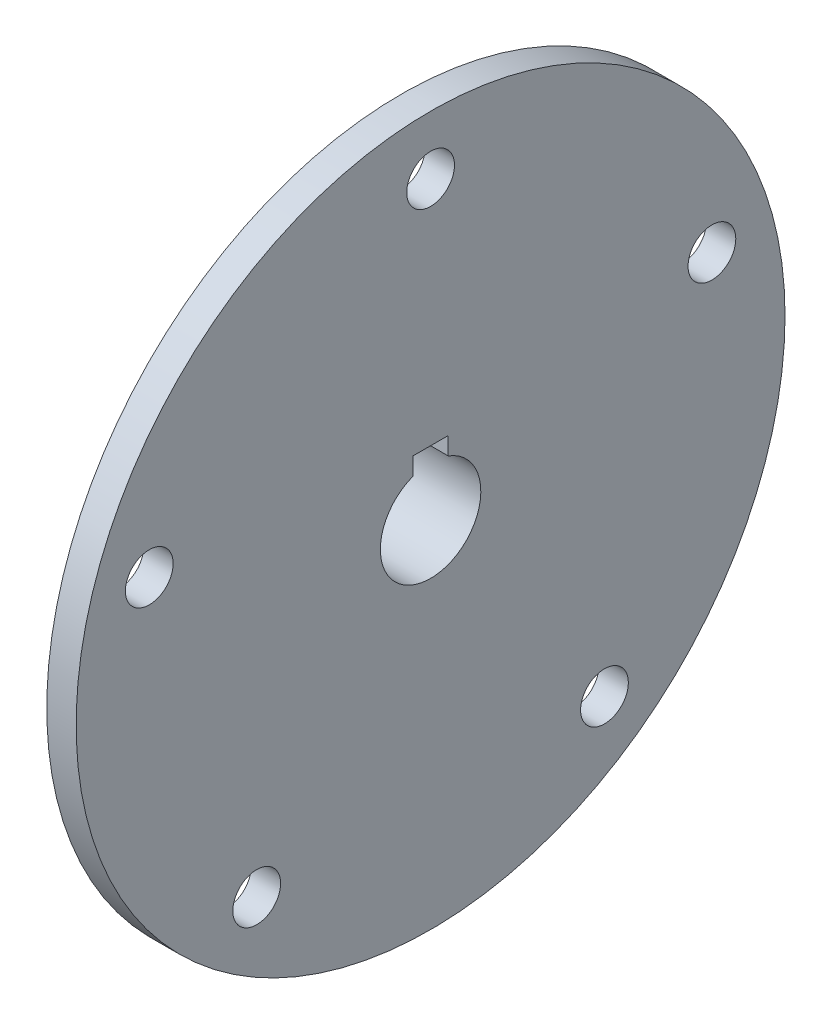
ISO-10303-21;
HEADER;
FILE_DESCRIPTION(('STEP AP214'),'2;1');
FILE_NAME('part.step','',(''),(''),'','','');
FILE_SCHEMA(('AUTOMOTIVE_DESIGN { 1 0 10303 214 1 1 1 1 }'));
ENDSEC;
DATA;
#1=APPLICATION_CONTEXT('core data for automotive mechanical design processes');
#2=APPLICATION_PROTOCOL_DEFINITION('international standard','automotive_design',2000,#1);
#3=PRODUCT_CONTEXT('',#1,'mechanical');
#4=PRODUCT('Part','Part','',(#3));
#5=PRODUCT_RELATED_PRODUCT_CATEGORY('part','',(#4));
#6=PRODUCT_DEFINITION_FORMATION('','',#4);
#7=PRODUCT_DEFINITION_CONTEXT('part definition',#1,'design');
#8=PRODUCT_DEFINITION('design','',#6,#7);
#9=PRODUCT_DEFINITION_SHAPE('','',#8);
#10=(LENGTH_UNIT() NAMED_UNIT(*) SI_UNIT(.MILLI.,.METRE.));
#11=(NAMED_UNIT(*) PLANE_ANGLE_UNIT() SI_UNIT($,.RADIAN.));
#12=(NAMED_UNIT(*) SI_UNIT($,.STERADIAN.) SOLID_ANGLE_UNIT());
#13=UNCERTAINTY_MEASURE_WITH_UNIT(LENGTH_MEASURE(1.E-05),#10,'distance_accuracy_value','');
#14=(GEOMETRIC_REPRESENTATION_CONTEXT(3) GLOBAL_UNCERTAINTY_ASSIGNED_CONTEXT((#13)) GLOBAL_UNIT_ASSIGNED_CONTEXT((#10,
#11,#12)) REPRESENTATION_CONTEXT('',''));
#15=CARTESIAN_POINT('',(0.,0.,0.));
#16=DIRECTION('',(0.,0.,1.));
#17=DIRECTION('',(1.,0.,0.));
#18=AXIS2_PLACEMENT_3D('',#15,#16,#17);
#19=CARTESIAN_POINT('',(-5.,0.,0.));
#20=DIRECTION('',(1.,0.,0.));
#21=DIRECTION('',(0.,0.,-1.));
#22=AXIS2_PLACEMENT_3D('',#19,#20,#21);
#23=CYLINDRICAL_SURFACE('',#22,60.325);
#24=CARTESIAN_POINT('',(-5.,0.,0.));
#25=DIRECTION('',(1.,0.,0.));
#26=DIRECTION('',(0.,0.,-1.));
#27=AXIS2_PLACEMENT_3D('',#24,#25,#26);
#28=CIRCLE('',#27,60.325);
#29=CARTESIAN_POINT('',(-5.,0.,-60.325));
#30=VERTEX_POINT('',#29);
#31=EDGE_CURVE('E48',#30,#30,#28,.T.);
#32=ORIENTED_EDGE('',*,*,#31,.T.);
#33=EDGE_LOOP('',(#32));
#34=FACE_BOUND('',#33,.T.);
#35=CARTESIAN_POINT('',(0.,0.,0.));
#36=DIRECTION('',(1.,0.,0.));
#37=DIRECTION('',(0.,0.,-1.));
#38=AXIS2_PLACEMENT_3D('',#35,#36,#37);
#39=CIRCLE('',#38,60.325);
#40=CARTESIAN_POINT('',(0.,0.,-60.325));
#41=VERTEX_POINT('',#40);
#42=EDGE_CURVE('E125',#41,#41,#39,.T.);
#43=ORIENTED_EDGE('',*,*,#42,.F.);
#44=EDGE_LOOP('',(#43));
#45=FACE_BOUND('',#44,.T.);
#46=ADVANCED_FACE('F41',(#34,#45),#23,.T.);
#47=CARTESIAN_POINT('',(-5.,0.,0.));
#48=DIRECTION('',(1.,0.,0.));
#49=DIRECTION('',(0.,0.,-1.));
#50=AXIS2_PLACEMENT_3D('',#47,#48,#49);
#51=PLANE('',#50);
#52=CARTESIAN_POINT('',(-5.,0.,0.));
#53=DIRECTION('',(1.,0.,0.));
#54=DIRECTION('',(0.,0.,-1.));
#55=AXIS2_PLACEMENT_3D('',#52,#53,#54);
#56=CIRCLE('',#55,17.5);
#57=CARTESIAN_POINT('',(-5.,0.,-17.5));
#58=VERTEX_POINT('',#57);
#59=EDGE_CURVE('E11',#58,#58,#56,.F.);
#60=ORIENTED_EDGE('',*,*,#59,.F.);
#61=EDGE_LOOP('',(#60));
#62=FACE_BOUND('',#61,.T.);
#63=CARTESIAN_POINT('',(-5.,50.342959834304,0.));
#64=DIRECTION('',(1.,0.,0.));
#65=DIRECTION('',(0.,0.,-1.));
#66=AXIS2_PLACEMENT_3D('',#63,#64,#65);
#67=CIRCLE('',#66,4.064);
#68=CARTESIAN_POINT('',(-5.,50.342959834304,-4.064));
#69=VERTEX_POINT('',#68);
#70=EDGE_CURVE('E122',#69,#69,#67,.T.);
#71=ORIENTED_EDGE('',*,*,#70,.T.);
#72=EDGE_LOOP('',(#71));
#73=FACE_BOUND('',#72,.T.);
#74=CARTESIAN_POINT('',(-5.,15.5568301359353,-47.879));
#75=DIRECTION('',(1.,0.,0.));
#76=DIRECTION('',(0.,0.,-1.));
#77=AXIS2_PLACEMENT_3D('',#74,#75,#76);
#78=CIRCLE('',#77,4.06400000000012);
#79=CARTESIAN_POINT('',(-5.,15.5568301359353,-51.9430000000001));
#80=VERTEX_POINT('',#79);
#81=EDGE_CURVE('E132',#80,#80,#78,.T.);
#82=ORIENTED_EDGE('',*,*,#81,.T.);
#83=EDGE_LOOP('',(#82));
#84=FACE_BOUND('',#83,.T.);
#85=CARTESIAN_POINT('',(-5.,-40.7283100530873,-29.5908493473562));
#86=DIRECTION('',(1.,0.,0.));
#87=DIRECTION('',(0.,0.,-1.));
#88=AXIS2_PLACEMENT_3D('',#85,#86,#87);
#89=CIRCLE('',#88,4.064);
#90=CARTESIAN_POINT('',(-5.,-40.7283100530873,-33.6548493473562));
#91=VERTEX_POINT('',#90);
#92=EDGE_CURVE('E138',#91,#91,#89,.T.);
#93=ORIENTED_EDGE('',*,*,#92,.T.);
#94=EDGE_LOOP('',(#93));
#95=FACE_BOUND('',#94,.T.);
#96=CARTESIAN_POINT('',(-5.,-40.7283100530873,29.5908493473563));
#97=DIRECTION('',(1.,0.,0.));
#98=DIRECTION('',(0.,0.,-1.));
#99=AXIS2_PLACEMENT_3D('',#96,#97,#98);
#100=CIRCLE('',#99,4.06400000000001);
#101=CARTESIAN_POINT('',(-5.,-40.7283100530873,25.5268493473562));
#102=VERTEX_POINT('',#101);
#103=EDGE_CURVE('E144',#102,#102,#100,.T.);
#104=ORIENTED_EDGE('',*,*,#103,.T.);
#105=EDGE_LOOP('',(#104));
#106=FACE_BOUND('',#105,.T.);
#107=CARTESIAN_POINT('',(-5.,15.5568301359353,47.879));
#108=DIRECTION('',(1.,0.,0.));
#109=DIRECTION('',(0.,0.,-1.));
#110=AXIS2_PLACEMENT_3D('',#107,#108,#109);
#111=CIRCLE('',#110,4.06400000000002);
#112=CARTESIAN_POINT('',(-5.,15.5568301359353,43.815));
#113=VERTEX_POINT('',#112);
#114=EDGE_CURVE('E121',#113,#113,#111,.T.);
#115=ORIENTED_EDGE('',*,*,#114,.T.);
#116=EDGE_LOOP('',(#115));
#117=FACE_BOUND('',#116,.T.);
#118=ORIENTED_EDGE('',*,*,#31,.F.);
#119=EDGE_LOOP('',(#118));
#120=FACE_BOUND('',#119,.T.);
#121=ADVANCED_FACE('F158',(#62,#73,#84,#95,#106,#117,#120),#51,.F.);
#122=CARTESIAN_POINT('',(0.,0.,0.));
#123=DIRECTION('',(1.,0.,0.));
#124=DIRECTION('',(0.,0.,-1.));
#125=AXIS2_PLACEMENT_3D('',#122,#123,#124);
#126=PLANE('',#125);
#127=DIRECTION('',(0.,1.,0.));
#128=VECTOR('',#127,1.);
#129=CARTESIAN_POINT('',(0.,11.0064036870495,3.));
#130=LINE('',#129,#128);
#131=CARTESIAN_POINT('',(0.,8.00640368704951,3.));
#132=VERTEX_POINT('',#131);
#133=CARTESIAN_POINT('',(0.,11.0064036870495,3.));
#134=VERTEX_POINT('',#133);
#135=EDGE_CURVE('E96',#132,#134,#130,.T.);
#136=ORIENTED_EDGE('',*,*,#135,.T.);
#137=DIRECTION('',(0.,0.,-1.));
#138=VECTOR('',#137,1.);
#139=CARTESIAN_POINT('',(0.,11.0064036870495,0.));
#140=LINE('',#139,#138);
#141=CARTESIAN_POINT('',(0.,11.0064036870495,-3.));
#142=VERTEX_POINT('',#141);
#143=EDGE_CURVE('E102',#134,#142,#140,.T.);
#144=ORIENTED_EDGE('',*,*,#143,.T.);
#145=DIRECTION('',(0.,-1.,0.));
#146=VECTOR('',#145,1.);
#147=CARTESIAN_POINT('',(0.,11.0064036870495,-3.));
#148=LINE('',#147,#146);
#149=CARTESIAN_POINT('',(0.,8.00640368704951,-3.));
#150=VERTEX_POINT('',#149);
#151=EDGE_CURVE('E55',#142,#150,#148,.T.);
#152=ORIENTED_EDGE('',*,*,#151,.T.);
#153=CARTESIAN_POINT('',(0.,0.,0.));
#154=DIRECTION('',(-1.,0.,0.));
#155=DIRECTION('',(0.,0.,1.));
#156=AXIS2_PLACEMENT_3D('',#153,#154,#155);
#157=CIRCLE('',#156,8.55);
#158=EDGE_CURVE('E91',#150,#132,#157,.T.);
#159=ORIENTED_EDGE('',*,*,#158,.T.);
#160=EDGE_LOOP('',(#136,#144,#152,#159));
#161=FACE_BOUND('',#160,.T.);
#162=CARTESIAN_POINT('',(0.,50.342959834304,0.));
#163=DIRECTION('',(1.,0.,0.));
#164=DIRECTION('',(0.,0.,-1.));
#165=AXIS2_PLACEMENT_3D('',#162,#163,#164);
#166=CIRCLE('',#165,4.064);
#167=CARTESIAN_POINT('',(0.,50.342959834304,-4.064));
#168=VERTEX_POINT('',#167);
#169=EDGE_CURVE('E126',#168,#168,#166,.T.);
#170=ORIENTED_EDGE('',*,*,#169,.F.);
#171=EDGE_LOOP('',(#170));
#172=FACE_BOUND('',#171,.T.);
#173=CARTESIAN_POINT('',(0.,15.5568301359353,-47.879));
#174=DIRECTION('',(1.,0.,0.));
#175=DIRECTION('',(0.,0.,-1.));
#176=AXIS2_PLACEMENT_3D('',#173,#174,#175);
#177=CIRCLE('',#176,4.06400000000012);
#178=CARTESIAN_POINT('',(0.,15.5568301359353,-51.9430000000001));
#179=VERTEX_POINT('',#178);
#180=EDGE_CURVE('E129',#179,#179,#177,.T.);
#181=ORIENTED_EDGE('',*,*,#180,.F.);
#182=EDGE_LOOP('',(#181));
#183=FACE_BOUND('',#182,.T.);
#184=CARTESIAN_POINT('',(0.,-40.7283100530873,-29.5908493473562));
#185=DIRECTION('',(1.,0.,0.));
#186=DIRECTION('',(0.,0.,-1.));
#187=AXIS2_PLACEMENT_3D('',#184,#185,#186);
#188=CIRCLE('',#187,4.064);
#189=CARTESIAN_POINT('',(0.,-40.7283100530873,-33.6548493473562));
#190=VERTEX_POINT('',#189);
#191=EDGE_CURVE('E135',#190,#190,#188,.T.);
#192=ORIENTED_EDGE('',*,*,#191,.F.);
#193=EDGE_LOOP('',(#192));
#194=FACE_BOUND('',#193,.T.);
#195=CARTESIAN_POINT('',(0.,-40.7283100530873,29.5908493473563));
#196=DIRECTION('',(1.,0.,0.));
#197=DIRECTION('',(0.,0.,-1.));
#198=AXIS2_PLACEMENT_3D('',#195,#196,#197);
#199=CIRCLE('',#198,4.06400000000001);
#200=CARTESIAN_POINT('',(0.,-40.7283100530873,25.5268493473562));
#201=VERTEX_POINT('',#200);
#202=EDGE_CURVE('E141',#201,#201,#199,.T.);
#203=ORIENTED_EDGE('',*,*,#202,.F.);
#204=EDGE_LOOP('',(#203));
#205=FACE_BOUND('',#204,.T.);
#206=CARTESIAN_POINT('',(0.,15.5568301359353,47.879));
#207=DIRECTION('',(1.,0.,0.));
#208=DIRECTION('',(0.,0.,-1.));
#209=AXIS2_PLACEMENT_3D('',#206,#207,#208);
#210=CIRCLE('',#209,4.06400000000002);
#211=CARTESIAN_POINT('',(0.,15.5568301359353,43.815));
#212=VERTEX_POINT('',#211);
#213=EDGE_CURVE('E147',#212,#212,#210,.T.);
#214=ORIENTED_EDGE('',*,*,#213,.F.);
#215=EDGE_LOOP('',(#214));
#216=FACE_BOUND('',#215,.T.);
#217=ORIENTED_EDGE('',*,*,#42,.T.);
#218=EDGE_LOOP('',(#217));
#219=FACE_BOUND('',#218,.T.);
#220=ADVANCED_FACE('F99',(#161,#172,#183,#194,#205,#216,#219),#126,.T.);
#221=CARTESIAN_POINT('',(-5.,15.5568301359353,47.879));
#222=DIRECTION('',(1.,0.,0.));
#223=DIRECTION('',(0.,0.,-1.));
#224=AXIS2_PLACEMENT_3D('',#221,#222,#223);
#225=CYLINDRICAL_SURFACE('',#224,4.06400000000002);
#226=ORIENTED_EDGE('',*,*,#114,.F.);
#227=EDGE_LOOP('',(#226));
#228=FACE_BOUND('',#227,.T.);
#229=ORIENTED_EDGE('',*,*,#213,.T.);
#230=EDGE_LOOP('',(#229));
#231=FACE_BOUND('',#230,.T.);
#232=ADVANCED_FACE('F170',(#228,#231),#225,.F.);
#233=CARTESIAN_POINT('',(-5.,-40.7283100530873,29.5908493473563));
#234=DIRECTION('',(1.,0.,0.));
#235=DIRECTION('',(0.,0.,-1.));
#236=AXIS2_PLACEMENT_3D('',#233,#234,#235);
#237=CYLINDRICAL_SURFACE('',#236,4.06400000000001);
#238=ORIENTED_EDGE('',*,*,#103,.F.);
#239=EDGE_LOOP('',(#238));
#240=FACE_BOUND('',#239,.T.);
#241=ORIENTED_EDGE('',*,*,#202,.T.);
#242=EDGE_LOOP('',(#241));
#243=FACE_BOUND('',#242,.T.);
#244=ADVANCED_FACE('F176',(#240,#243),#237,.F.);
#245=CARTESIAN_POINT('',(-5.,-40.7283100530873,-29.5908493473562));
#246=DIRECTION('',(1.,0.,0.));
#247=DIRECTION('',(0.,0.,-1.));
#248=AXIS2_PLACEMENT_3D('',#245,#246,#247);
#249=CYLINDRICAL_SURFACE('',#248,4.064);
#250=ORIENTED_EDGE('',*,*,#92,.F.);
#251=EDGE_LOOP('',(#250));
#252=FACE_BOUND('',#251,.T.);
#253=ORIENTED_EDGE('',*,*,#191,.T.);
#254=EDGE_LOOP('',(#253));
#255=FACE_BOUND('',#254,.T.);
#256=ADVANCED_FACE('F180',(#252,#255),#249,.F.);
#257=CARTESIAN_POINT('',(-5.,15.5568301359353,-47.879));
#258=DIRECTION('',(1.,0.,0.));
#259=DIRECTION('',(0.,0.,-1.));
#260=AXIS2_PLACEMENT_3D('',#257,#258,#259);
#261=CYLINDRICAL_SURFACE('',#260,4.06400000000012);
#262=ORIENTED_EDGE('',*,*,#81,.F.);
#263=EDGE_LOOP('',(#262));
#264=FACE_BOUND('',#263,.T.);
#265=ORIENTED_EDGE('',*,*,#180,.T.);
#266=EDGE_LOOP('',(#265));
#267=FACE_BOUND('',#266,.T.);
#268=ADVANCED_FACE('F184',(#264,#267),#261,.F.);
#269=CARTESIAN_POINT('',(-5.,50.342959834304,0.));
#270=DIRECTION('',(1.,0.,0.));
#271=DIRECTION('',(0.,0.,-1.));
#272=AXIS2_PLACEMENT_3D('',#269,#270,#271);
#273=CYLINDRICAL_SURFACE('',#272,4.064);
#274=ORIENTED_EDGE('',*,*,#70,.F.);
#275=EDGE_LOOP('',(#274));
#276=FACE_BOUND('',#275,.T.);
#277=ORIENTED_EDGE('',*,*,#169,.T.);
#278=EDGE_LOOP('',(#277));
#279=FACE_BOUND('',#278,.T.);
#280=ADVANCED_FACE('F188',(#276,#279),#273,.F.);
#281=CARTESIAN_POINT('',(-35.,0.,0.));
#282=DIRECTION('',(1.,0.,0.));
#283=DIRECTION('',(0.,0.,-1.));
#284=AXIS2_PLACEMENT_3D('',#281,#282,#283);
#285=CYLINDRICAL_SURFACE('',#284,17.5);
#286=CARTESIAN_POINT('',(-35.,0.,0.));
#287=DIRECTION('',(-1.,0.,0.));
#288=DIRECTION('',(0.,0.,1.));
#289=AXIS2_PLACEMENT_3D('',#286,#287,#288);
#290=CIRCLE('',#289,17.5);
#291=CARTESIAN_POINT('',(-35.,0.,17.5));
#292=VERTEX_POINT('',#291);
#293=EDGE_CURVE('E116',#292,#292,#290,.T.);
#294=ORIENTED_EDGE('',*,*,#293,.F.);
#295=EDGE_LOOP('',(#294));
#296=FACE_BOUND('',#295,.T.);
#297=ORIENTED_EDGE('',*,*,#59,.T.);
#298=EDGE_LOOP('',(#297));
#299=FACE_BOUND('',#298,.T.);
#300=ADVANCED_FACE('F192',(#296,#299),#285,.T.);
#301=CARTESIAN_POINT('',(-35.,0.,0.));
#302=DIRECTION('',(-1.,0.,0.));
#303=DIRECTION('',(0.,0.,1.));
#304=AXIS2_PLACEMENT_3D('',#301,#302,#303);
#305=PLANE('',#304);
#306=DIRECTION('',(0.,1.,0.));
#307=VECTOR('',#306,1.);
#308=CARTESIAN_POINT('',(-35.,11.0064036870495,3.));
#309=LINE('',#308,#307);
#310=CARTESIAN_POINT('',(-35.,8.00640368704951,3.));
#311=VERTEX_POINT('',#310);
#312=CARTESIAN_POINT('',(-35.,11.0064036870495,3.));
#313=VERTEX_POINT('',#312);
#314=EDGE_CURVE('E63',#311,#313,#309,.T.);
#315=ORIENTED_EDGE('',*,*,#314,.F.);
#316=CARTESIAN_POINT('',(-35.,0.,0.));
#317=DIRECTION('',(-1.,0.,0.));
#318=DIRECTION('',(0.,0.,1.));
#319=AXIS2_PLACEMENT_3D('',#316,#317,#318);
#320=CIRCLE('',#319,8.55);
#321=CARTESIAN_POINT('',(-35.,8.00640368704951,-3.));
#322=VERTEX_POINT('',#321);
#323=EDGE_CURVE('E111',#322,#311,#320,.T.);
#324=ORIENTED_EDGE('',*,*,#323,.F.);
#325=DIRECTION('',(0.,-1.,0.));
#326=VECTOR('',#325,1.);
#327=CARTESIAN_POINT('',(-35.,11.0064036870495,-3.));
#328=LINE('',#327,#326);
#329=CARTESIAN_POINT('',(-35.,11.0064036870495,-3.));
#330=VERTEX_POINT('',#329);
#331=EDGE_CURVE('E83',#330,#322,#328,.T.);
#332=ORIENTED_EDGE('',*,*,#331,.F.);
#333=DIRECTION('',(0.,0.,-1.));
#334=VECTOR('',#333,1.);
#335=CARTESIAN_POINT('',(-35.,11.0064036870495,0.));
#336=LINE('',#335,#334);
#337=EDGE_CURVE('E107',#313,#330,#336,.T.);
#338=ORIENTED_EDGE('',*,*,#337,.F.);
#339=EDGE_LOOP('',(#315,#324,#332,#338));
#340=FACE_BOUND('',#339,.T.);
#341=ORIENTED_EDGE('',*,*,#293,.T.);
#342=EDGE_LOOP('',(#341));
#343=FACE_BOUND('',#342,.T.);
#344=ADVANCED_FACE('F196',(#340,#343),#305,.T.);
#345=CARTESIAN_POINT('',(0.,11.0064036870495,3.));
#346=DIRECTION('',(0.,0.,1.));
#347=DIRECTION('',(0.,-1.,0.));
#348=AXIS2_PLACEMENT_3D('',#345,#346,#347);
#349=PLANE('',#348);
#350=ORIENTED_EDGE('',*,*,#314,.T.);
#351=DIRECTION('',(-1.,0.,0.));
#352=VECTOR('',#351,1.);
#353=CARTESIAN_POINT('',(0.,11.0064036870495,3.));
#354=LINE('',#353,#352);
#355=EDGE_CURVE('E114',#134,#313,#354,.T.);
#356=ORIENTED_EDGE('',*,*,#355,.F.);
#357=ORIENTED_EDGE('',*,*,#135,.F.);
#358=DIRECTION('',(-1.,0.,0.));
#359=VECTOR('',#358,1.);
#360=CARTESIAN_POINT('',(0.,8.00640368704951,3.));
#361=LINE('',#360,#359);
#362=EDGE_CURVE('E87',#132,#311,#361,.T.);
#363=ORIENTED_EDGE('',*,*,#362,.T.);
#364=EDGE_LOOP('',(#350,#356,#357,#363));
#365=FACE_BOUND('',#364,.T.);
#366=ADVANCED_FACE('F200',(#365),#349,.F.);
#367=CARTESIAN_POINT('',(0.,0.,0.));
#368=DIRECTION('',(-1.,0.,0.));
#369=DIRECTION('',(0.,0.,1.));
#370=AXIS2_PLACEMENT_3D('',#367,#368,#369);
#371=CYLINDRICAL_SURFACE('',#370,8.55);
#372=ORIENTED_EDGE('',*,*,#323,.T.);
#373=ORIENTED_EDGE('',*,*,#362,.F.);
#374=ORIENTED_EDGE('',*,*,#158,.F.);
#375=DIRECTION('',(-1.,0.,0.));
#376=VECTOR('',#375,1.);
#377=CARTESIAN_POINT('',(0.,8.00640368704951,-3.));
#378=LINE('',#377,#376);
#379=EDGE_CURVE('E79',#150,#322,#378,.T.);
#380=ORIENTED_EDGE('',*,*,#379,.T.);
#381=EDGE_LOOP('',(#372,#373,#374,#380));
#382=FACE_BOUND('',#381,.T.);
#383=ADVANCED_FACE('F92',(#382),#371,.F.);
#384=CARTESIAN_POINT('',(0.,11.0064036870495,-3.));
#385=DIRECTION('',(0.,0.,-1.));
#386=DIRECTION('',(0.,1.,0.));
#387=AXIS2_PLACEMENT_3D('',#384,#385,#386);
#388=PLANE('',#387);
#389=ORIENTED_EDGE('',*,*,#331,.T.);
#390=ORIENTED_EDGE('',*,*,#379,.F.);
#391=ORIENTED_EDGE('',*,*,#151,.F.);
#392=DIRECTION('',(-1.,0.,0.));
#393=VECTOR('',#392,1.);
#394=CARTESIAN_POINT('',(0.,11.0064036870495,-3.));
#395=LINE('',#394,#393);
#396=EDGE_CURVE('E88',#142,#330,#395,.T.);
#397=ORIENTED_EDGE('',*,*,#396,.T.);
#398=EDGE_LOOP('',(#389,#390,#391,#397));
#399=FACE_BOUND('',#398,.T.);
#400=ADVANCED_FACE('F81',(#399),#388,.F.);
#401=CARTESIAN_POINT('',(0.,11.0064036870495,0.));
#402=DIRECTION('',(0.,1.,0.));
#403=DIRECTION('',(0.,0.,1.));
#404=AXIS2_PLACEMENT_3D('',#401,#402,#403);
#405=PLANE('',#404);
#406=ORIENTED_EDGE('',*,*,#337,.T.);
#407=ORIENTED_EDGE('',*,*,#396,.F.);
#408=ORIENTED_EDGE('',*,*,#143,.F.);
#409=ORIENTED_EDGE('',*,*,#355,.T.);
#410=EDGE_LOOP('',(#406,#407,#408,#409));
#411=FACE_BOUND('',#410,.T.);
#412=ADVANCED_FACE('F202',(#411),#405,.F.);
#413=CLOSED_SHELL('',(#46,#121,#220,#232,#244,#256,#268,#280,#300,#344,#366,#383,#400,#412));
#414=MANIFOLD_SOLID_BREP('B2',#413);
#415=ADVANCED_BREP_SHAPE_REPRESENTATION('',(#18,#414),#14);
#416=SHAPE_DEFINITION_REPRESENTATION(#9,#415);
ENDSEC;
END-ISO-10303-21;
